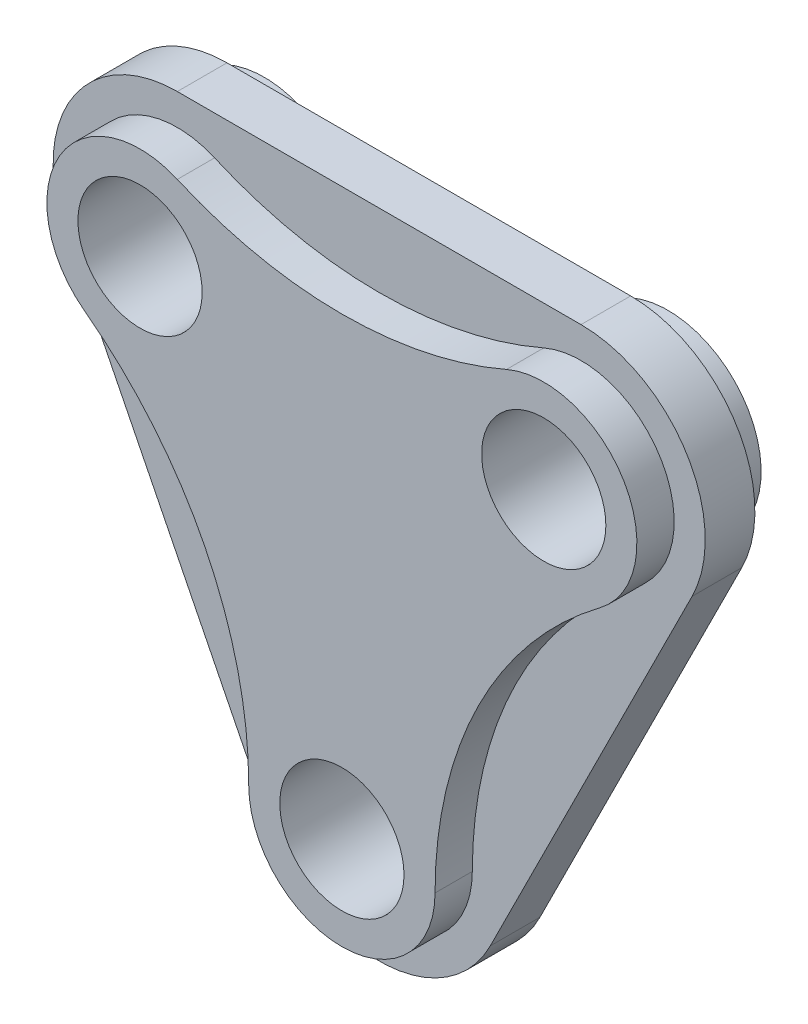
ISO-10303-21;
HEADER;
FILE_DESCRIPTION(('STEP AP214'),'2;1');
FILE_NAME('part.step','',(''),(''),'','','');
FILE_SCHEMA(('AUTOMOTIVE_DESIGN { 1 0 10303 214 1 1 1 1 }'));
ENDSEC;
DATA;
#1=APPLICATION_CONTEXT('core data for automotive mechanical design processes');
#2=APPLICATION_PROTOCOL_DEFINITION('international standard','automotive_design',2000,#1);
#3=PRODUCT_CONTEXT('',#1,'mechanical');
#4=PRODUCT('Part','Part','',(#3));
#5=PRODUCT_RELATED_PRODUCT_CATEGORY('part','',(#4));
#6=PRODUCT_DEFINITION_FORMATION('','',#4);
#7=PRODUCT_DEFINITION_CONTEXT('part definition',#1,'design');
#8=PRODUCT_DEFINITION('design','',#6,#7);
#9=PRODUCT_DEFINITION_SHAPE('','',#8);
#10=(LENGTH_UNIT() NAMED_UNIT(*) SI_UNIT(.MILLI.,.METRE.));
#11=(NAMED_UNIT(*) PLANE_ANGLE_UNIT() SI_UNIT($,.RADIAN.));
#12=(NAMED_UNIT(*) SI_UNIT($,.STERADIAN.) SOLID_ANGLE_UNIT());
#13=UNCERTAINTY_MEASURE_WITH_UNIT(LENGTH_MEASURE(1.E-05),#10,'distance_accuracy_value','');
#14=(GEOMETRIC_REPRESENTATION_CONTEXT(3) GLOBAL_UNCERTAINTY_ASSIGNED_CONTEXT((#13)) GLOBAL_UNIT_ASSIGNED_CONTEXT((#10,
#11,#12)) REPRESENTATION_CONTEXT('',''));
#15=CARTESIAN_POINT('',(0.,0.,0.));
#16=DIRECTION('',(0.,0.,1.));
#17=DIRECTION('',(1.,0.,0.));
#18=AXIS2_PLACEMENT_3D('',#15,#16,#17);
#19=CARTESIAN_POINT('',(0.,74.4668550430326,10.));
#20=DIRECTION('',(0.,0.,-1.));
#21=DIRECTION('',(-1.,0.,0.));
#22=AXIS2_PLACEMENT_3D('',#19,#20,#21);
#23=CYLINDRICAL_SURFACE('',#22,66.2500000000001);
#24=DIRECTION('',(0.,0.,-1.));
#25=VECTOR('',#24,1.);
#26=CARTESIAN_POINT('',(-26.5,13.7477270848675,10.));
#27=LINE('',#26,#25);
#28=CARTESIAN_POINT('',(-26.5,13.7477270848675,-4.));
#29=VERTEX_POINT('',#28);
#30=CARTESIAN_POINT('',(-26.5,13.7477270848675,-10.));
#31=VERTEX_POINT('',#30);
#32=EDGE_CURVE('E54',#29,#31,#27,.T.);
#33=ORIENTED_EDGE('',*,*,#32,.F.);
#34=CARTESIAN_POINT('',(0.,74.4668550430326,-4.));
#35=DIRECTION('',(0.,0.,1.));
#36=DIRECTION('',(1.,0.,0.));
#37=AXIS2_PLACEMENT_3D('',#34,#35,#36);
#38=CIRCLE('',#37,66.2500000000001);
#39=CARTESIAN_POINT('',(26.5,13.7477270848675,-4.));
#40=VERTEX_POINT('',#39);
#41=EDGE_CURVE('E336',#29,#40,#38,.T.);
#42=ORIENTED_EDGE('',*,*,#41,.T.);
#43=DIRECTION('',(0.,0.,-1.));
#44=VECTOR('',#43,1.);
#45=CARTESIAN_POINT('',(26.5,13.7477270848675,10.));
#46=LINE('',#45,#44);
#47=CARTESIAN_POINT('',(26.5,13.7477270848675,-10.));
#48=VERTEX_POINT('',#47);
#49=EDGE_CURVE('E243',#40,#48,#46,.T.);
#50=ORIENTED_EDGE('',*,*,#49,.T.);
#51=CARTESIAN_POINT('',(0.,74.4668550430326,-10.));
#52=DIRECTION('',(0.,0.,1.));
#53=DIRECTION('',(1.,0.,0.));
#54=AXIS2_PLACEMENT_3D('',#51,#52,#53);
#55=CIRCLE('',#54,66.2500000000001);
#56=EDGE_CURVE('E199',#31,#48,#55,.T.);
#57=ORIENTED_EDGE('',*,*,#56,.F.);
#58=EDGE_LOOP('',(#33,#42,#50,#57));
#59=FACE_BOUND('',#58,.T.);
#60=ADVANCED_FACE('F45',(#59),#23,.F.);
#61=CARTESIAN_POINT('',(-32.5,0.,10.));
#62=DIRECTION('',(0.,0.,-1.));
#63=DIRECTION('',(-1.,0.,0.));
#64=AXIS2_PLACEMENT_3D('',#61,#62,#63);
#65=CYLINDRICAL_SURFACE('',#64,15.);
#66=DIRECTION('',(0.,0.,-1.));
#67=VECTOR('',#66,1.);
#68=CARTESIAN_POINT('',(-41.5,-12.,10.));
#69=LINE('',#68,#67);
#70=CARTESIAN_POINT('',(-41.5,-12.,-4.));
#71=VERTEX_POINT('',#70);
#72=CARTESIAN_POINT('',(-41.5,-12.,-10.));
#73=VERTEX_POINT('',#72);
#74=EDGE_CURVE('E293',#71,#73,#69,.T.);
#75=ORIENTED_EDGE('',*,*,#74,.F.);
#76=CARTESIAN_POINT('',(-32.5,0.,-4.));
#77=DIRECTION('',(0.,0.,1.));
#78=DIRECTION('',(1.,0.,0.));
#79=AXIS2_PLACEMENT_3D('',#76,#77,#78);
#80=CIRCLE('',#79,15.);
#81=EDGE_CURVE('E61',#71,#29,#80,.F.);
#82=ORIENTED_EDGE('',*,*,#81,.T.);
#83=ORIENTED_EDGE('',*,*,#32,.T.);
#84=CARTESIAN_POINT('',(-32.5,0.,-10.));
#85=DIRECTION('',(0.,0.,1.));
#86=DIRECTION('',(1.,0.,0.));
#87=AXIS2_PLACEMENT_3D('',#84,#85,#86);
#88=CIRCLE('',#87,15.);
#89=EDGE_CURVE('E204',#73,#31,#88,.F.);
#90=ORIENTED_EDGE('',*,*,#89,.F.);
#91=EDGE_LOOP('',(#75,#82,#83,#90));
#92=FACE_BOUND('',#91,.T.);
#93=ADVANCED_FACE('F309',(#92),#65,.T.);
#94=CARTESIAN_POINT('',(-81.2500000000001,-65.0000000000001,10.));
#95=DIRECTION('',(0.,0.,-1.));
#96=DIRECTION('',(-1.,0.,0.));
#97=AXIS2_PLACEMENT_3D('',#94,#95,#96);
#98=CYLINDRICAL_SURFACE('',#97,66.2500000000001);
#99=CARTESIAN_POINT('',(-81.2500000000001,-65.0000000000001,-4.));
#100=DIRECTION('',(0.,0.,1.));
#101=DIRECTION('',(1.,0.,0.));
#102=AXIS2_PLACEMENT_3D('',#99,#100,#101);
#103=CIRCLE('',#102,66.2500000000001);
#104=CARTESIAN_POINT('',(-15.,-65.,-4.));
#105=VERTEX_POINT('',#104);
#106=EDGE_CURVE('E69',#71,#105,#103,.F.);
#107=ORIENTED_EDGE('',*,*,#106,.F.);
#108=ORIENTED_EDGE('',*,*,#74,.T.);
#109=CARTESIAN_POINT('',(-81.2500000000001,-65.0000000000001,-10.));
#110=DIRECTION('',(0.,0.,1.));
#111=DIRECTION('',(1.,0.,0.));
#112=AXIS2_PLACEMENT_3D('',#109,#110,#111);
#113=CIRCLE('',#112,66.2500000000001);
#114=CARTESIAN_POINT('',(-15.,-65.,-10.));
#115=VERTEX_POINT('',#114);
#116=EDGE_CURVE('E248',#73,#115,#113,.F.);
#117=ORIENTED_EDGE('',*,*,#116,.T.);
#118=DIRECTION('',(0.,0.,-1.));
#119=VECTOR('',#118,1.);
#120=CARTESIAN_POINT('',(-15.,-65.,10.));
#121=LINE('',#120,#119);
#122=EDGE_CURVE('E289',#105,#115,#121,.T.);
#123=ORIENTED_EDGE('',*,*,#122,.F.);
#124=EDGE_LOOP('',(#107,#108,#117,#123));
#125=FACE_BOUND('',#124,.T.);
#126=ADVANCED_FACE('F303',(#125),#98,.F.);
#127=CARTESIAN_POINT('',(0.,-65.,10.));
#128=DIRECTION('',(0.,0.,-1.));
#129=DIRECTION('',(-1.,0.,0.));
#130=AXIS2_PLACEMENT_3D('',#127,#128,#129);
#131=CYLINDRICAL_SURFACE('',#130,15.);
#132=CARTESIAN_POINT('',(0.,-65.,-4.));
#133=DIRECTION('',(0.,0.,1.));
#134=DIRECTION('',(1.,0.,0.));
#135=AXIS2_PLACEMENT_3D('',#132,#133,#134);
#136=CIRCLE('',#135,15.);
#137=CARTESIAN_POINT('',(15.,-65.,-4.));
#138=VERTEX_POINT('',#137);
#139=EDGE_CURVE('E327',#105,#138,#136,.T.);
#140=ORIENTED_EDGE('',*,*,#139,.F.);
#141=ORIENTED_EDGE('',*,*,#122,.T.);
#142=CARTESIAN_POINT('',(0.,-65.,-10.));
#143=DIRECTION('',(0.,0.,1.));
#144=DIRECTION('',(1.,0.,0.));
#145=AXIS2_PLACEMENT_3D('',#142,#143,#144);
#146=CIRCLE('',#145,15.);
#147=CARTESIAN_POINT('',(15.,-65.,-10.));
#148=VERTEX_POINT('',#147);
#149=EDGE_CURVE('E252',#115,#148,#146,.T.);
#150=ORIENTED_EDGE('',*,*,#149,.T.);
#151=DIRECTION('',(0.,0.,-1.));
#152=VECTOR('',#151,1.);
#153=CARTESIAN_POINT('',(15.,-65.,10.));
#154=LINE('',#153,#152);
#155=EDGE_CURVE('E284',#138,#148,#154,.T.);
#156=ORIENTED_EDGE('',*,*,#155,.F.);
#157=EDGE_LOOP('',(#140,#141,#150,#156));
#158=FACE_BOUND('',#157,.T.);
#159=ADVANCED_FACE('F326',(#158),#131,.T.);
#160=CARTESIAN_POINT('',(81.2500000000001,-65.0000000000001,10.));
#161=DIRECTION('',(0.,0.,-1.));
#162=DIRECTION('',(-1.,0.,0.));
#163=AXIS2_PLACEMENT_3D('',#160,#161,#162);
#164=CYLINDRICAL_SURFACE('',#163,66.2500000000001);
#165=DIRECTION('',(0.,0.,-1.));
#166=VECTOR('',#165,1.);
#167=CARTESIAN_POINT('',(41.5,-12.,10.));
#168=LINE('',#167,#166);
#169=CARTESIAN_POINT('',(41.5,-12.,-4.));
#170=VERTEX_POINT('',#169);
#171=CARTESIAN_POINT('',(41.5,-12.,-10.));
#172=VERTEX_POINT('',#171);
#173=EDGE_CURVE('E279',#170,#172,#168,.T.);
#174=ORIENTED_EDGE('',*,*,#173,.F.);
#175=CARTESIAN_POINT('',(81.2500000000001,-65.0000000000001,-4.));
#176=DIRECTION('',(0.,0.,1.));
#177=DIRECTION('',(1.,0.,0.));
#178=AXIS2_PLACEMENT_3D('',#175,#176,#177);
#179=CIRCLE('',#178,66.2500000000001);
#180=EDGE_CURVE('E322',#170,#138,#179,.T.);
#181=ORIENTED_EDGE('',*,*,#180,.T.);
#182=ORIENTED_EDGE('',*,*,#155,.T.);
#183=CARTESIAN_POINT('',(81.2500000000001,-65.0000000000001,-10.));
#184=DIRECTION('',(0.,0.,1.));
#185=DIRECTION('',(1.,0.,0.));
#186=AXIS2_PLACEMENT_3D('',#183,#184,#185);
#187=CIRCLE('',#186,66.2500000000001);
#188=EDGE_CURVE('E256',#172,#148,#187,.T.);
#189=ORIENTED_EDGE('',*,*,#188,.F.);
#190=EDGE_LOOP('',(#174,#181,#182,#189));
#191=FACE_BOUND('',#190,.T.);
#192=ADVANCED_FACE('F319',(#191),#164,.F.);
#193=CARTESIAN_POINT('',(32.5,0.,10.));
#194=DIRECTION('',(0.,0.,-1.));
#195=DIRECTION('',(-1.,0.,0.));
#196=AXIS2_PLACEMENT_3D('',#193,#194,#195);
#197=CYLINDRICAL_SURFACE('',#196,15.);
#198=CARTESIAN_POINT('',(32.5,0.,-4.));
#199=DIRECTION('',(0.,0.,1.));
#200=DIRECTION('',(1.,0.,0.));
#201=AXIS2_PLACEMENT_3D('',#198,#199,#200);
#202=CIRCLE('',#201,15.);
#203=EDGE_CURVE('E333',#170,#40,#202,.T.);
#204=ORIENTED_EDGE('',*,*,#203,.F.);
#205=ORIENTED_EDGE('',*,*,#173,.T.);
#206=CARTESIAN_POINT('',(32.5,0.,-10.));
#207=DIRECTION('',(0.,0.,1.));
#208=DIRECTION('',(1.,0.,0.));
#209=AXIS2_PLACEMENT_3D('',#206,#207,#208);
#210=CIRCLE('',#209,15.);
#211=EDGE_CURVE('E260',#172,#48,#210,.T.);
#212=ORIENTED_EDGE('',*,*,#211,.T.);
#213=ORIENTED_EDGE('',*,*,#49,.F.);
#214=EDGE_LOOP('',(#204,#205,#212,#213));
#215=FACE_BOUND('',#214,.T.);
#216=ADVANCED_FACE('F331',(#215),#197,.T.);
#217=CARTESIAN_POINT('',(0.,74.4668550430326,4.));
#218=DIRECTION('',(0.,0.,1.));
#219=DIRECTION('',(1.,0.,0.));
#220=AXIS2_PLACEMENT_3D('',#217,#218,#219);
#221=CIRCLE('',#220,66.2500000000001);
#222=CARTESIAN_POINT('',(-26.5,13.7477270848675,4.));
#223=VERTEX_POINT('',#222);
#224=CARTESIAN_POINT('',(26.5,13.7477270848675,4.));
#225=VERTEX_POINT('',#224);
#226=EDGE_CURVE('E408',#223,#225,#221,.T.);
#227=ORIENTED_EDGE('',*,*,#226,.F.);
#228=CARTESIAN_POINT('',(-26.5,13.7477270848675,10.));
#229=VERTEX_POINT('',#228);
#230=EDGE_CURVE('E11',#229,#223,#27,.T.);
#231=ORIENTED_EDGE('',*,*,#230,.F.);
#232=CARTESIAN_POINT('',(0.,74.4668550430326,10.));
#233=DIRECTION('',(0.,0.,1.));
#234=DIRECTION('',(1.,0.,0.));
#235=AXIS2_PLACEMENT_3D('',#232,#233,#234);
#236=CIRCLE('',#235,66.2500000000001);
#237=CARTESIAN_POINT('',(26.5,13.7477270848675,10.));
#238=VERTEX_POINT('',#237);
#239=EDGE_CURVE('E210',#229,#238,#236,.T.);
#240=ORIENTED_EDGE('',*,*,#239,.T.);
#241=EDGE_CURVE('E275',#238,#225,#46,.T.);
#242=ORIENTED_EDGE('',*,*,#241,.T.);
#243=EDGE_LOOP('',(#227,#231,#240,#242));
#244=FACE_BOUND('',#243,.T.);
#245=ADVANCED_FACE('F47',(#244),#23,.F.);
#246=CARTESIAN_POINT('',(-32.5,0.,4.));
#247=DIRECTION('',(0.,0.,1.));
#248=DIRECTION('',(1.,0.,0.));
#249=AXIS2_PLACEMENT_3D('',#246,#247,#248);
#250=CIRCLE('',#249,15.);
#251=CARTESIAN_POINT('',(-41.5,-12.,4.));
#252=VERTEX_POINT('',#251);
#253=EDGE_CURVE('E401',#252,#223,#250,.F.);
#254=ORIENTED_EDGE('',*,*,#253,.F.);
#255=CARTESIAN_POINT('',(-41.5,-12.,10.));
#256=VERTEX_POINT('',#255);
#257=EDGE_CURVE('E294',#256,#252,#69,.T.);
#258=ORIENTED_EDGE('',*,*,#257,.F.);
#259=CARTESIAN_POINT('',(-32.5,0.,10.));
#260=DIRECTION('',(0.,0.,1.));
#261=DIRECTION('',(1.,0.,0.));
#262=AXIS2_PLACEMENT_3D('',#259,#260,#261);
#263=CIRCLE('',#262,15.);
#264=EDGE_CURVE('E214',#256,#229,#263,.F.);
#265=ORIENTED_EDGE('',*,*,#264,.T.);
#266=ORIENTED_EDGE('',*,*,#230,.T.);
#267=EDGE_LOOP('',(#254,#258,#265,#266));
#268=FACE_BOUND('',#267,.T.);
#269=ADVANCED_FACE('F440',(#268),#65,.T.);
#270=ORIENTED_EDGE('',*,*,#257,.T.);
#271=CARTESIAN_POINT('',(-81.2500000000001,-65.0000000000001,4.));
#272=DIRECTION('',(0.,0.,1.));
#273=DIRECTION('',(1.,0.,0.));
#274=AXIS2_PLACEMENT_3D('',#271,#272,#273);
#275=CIRCLE('',#274,66.2500000000001);
#276=CARTESIAN_POINT('',(-15.,-65.,4.));
#277=VERTEX_POINT('',#276);
#278=EDGE_CURVE('E352',#252,#277,#275,.F.);
#279=ORIENTED_EDGE('',*,*,#278,.T.);
#280=CARTESIAN_POINT('',(-15.,-65.,10.));
#281=VERTEX_POINT('',#280);
#282=EDGE_CURVE('E290',#281,#277,#121,.T.);
#283=ORIENTED_EDGE('',*,*,#282,.F.);
#284=CARTESIAN_POINT('',(-81.2500000000001,-65.0000000000001,10.));
#285=DIRECTION('',(0.,0.,1.));
#286=DIRECTION('',(1.,0.,0.));
#287=AXIS2_PLACEMENT_3D('',#284,#285,#286);
#288=CIRCLE('',#287,66.2500000000001);
#289=EDGE_CURVE('E219',#256,#281,#288,.F.);
#290=ORIENTED_EDGE('',*,*,#289,.F.);
#291=EDGE_LOOP('',(#270,#279,#283,#290));
#292=FACE_BOUND('',#291,.T.);
#293=ADVANCED_FACE('F447',(#292),#98,.F.);
#294=ORIENTED_EDGE('',*,*,#282,.T.);
#295=CARTESIAN_POINT('',(0.,-65.,4.));
#296=DIRECTION('',(0.,0.,1.));
#297=DIRECTION('',(1.,0.,0.));
#298=AXIS2_PLACEMENT_3D('',#295,#296,#297);
#299=CIRCLE('',#298,15.);
#300=CARTESIAN_POINT('',(15.,-65.,4.));
#301=VERTEX_POINT('',#300);
#302=EDGE_CURVE('E418',#277,#301,#299,.T.);
#303=ORIENTED_EDGE('',*,*,#302,.T.);
#304=CARTESIAN_POINT('',(15.,-65.,10.));
#305=VERTEX_POINT('',#304);
#306=EDGE_CURVE('E285',#305,#301,#154,.T.);
#307=ORIENTED_EDGE('',*,*,#306,.F.);
#308=CARTESIAN_POINT('',(0.,-65.,10.));
#309=DIRECTION('',(0.,0.,1.));
#310=DIRECTION('',(1.,0.,0.));
#311=AXIS2_PLACEMENT_3D('',#308,#309,#310);
#312=CIRCLE('',#311,15.);
#313=EDGE_CURVE('E222',#281,#305,#312,.T.);
#314=ORIENTED_EDGE('',*,*,#313,.F.);
#315=EDGE_LOOP('',(#294,#303,#307,#314));
#316=FACE_BOUND('',#315,.T.);
#317=ADVANCED_FACE('F469',(#316),#131,.T.);
#318=CARTESIAN_POINT('',(81.2500000000001,-65.0000000000001,4.));
#319=DIRECTION('',(0.,0.,1.));
#320=DIRECTION('',(1.,0.,0.));
#321=AXIS2_PLACEMENT_3D('',#318,#319,#320);
#322=CIRCLE('',#321,66.2500000000001);
#323=CARTESIAN_POINT('',(41.5,-12.,4.));
#324=VERTEX_POINT('',#323);
#325=EDGE_CURVE('E415',#324,#301,#322,.T.);
#326=ORIENTED_EDGE('',*,*,#325,.F.);
#327=CARTESIAN_POINT('',(41.5,-12.,10.));
#328=VERTEX_POINT('',#327);
#329=EDGE_CURVE('E280',#328,#324,#168,.T.);
#330=ORIENTED_EDGE('',*,*,#329,.F.);
#331=CARTESIAN_POINT('',(81.2500000000001,-65.0000000000001,10.));
#332=DIRECTION('',(0.,0.,1.));
#333=DIRECTION('',(1.,0.,0.));
#334=AXIS2_PLACEMENT_3D('',#331,#332,#333);
#335=CIRCLE('',#334,66.2500000000001);
#336=EDGE_CURVE('E225',#328,#305,#335,.T.);
#337=ORIENTED_EDGE('',*,*,#336,.T.);
#338=ORIENTED_EDGE('',*,*,#306,.T.);
#339=EDGE_LOOP('',(#326,#330,#337,#338));
#340=FACE_BOUND('',#339,.T.);
#341=ADVANCED_FACE('F465',(#340),#164,.F.);
#342=CARTESIAN_POINT('',(32.5,0.,10.));
#343=DIRECTION('',(0.,0.,-1.));
#344=DIRECTION('',(-1.,0.,0.));
#345=AXIS2_PLACEMENT_3D('',#342,#343,#344);
#346=CYLINDRICAL_SURFACE('',#345,10.);
#347=CARTESIAN_POINT('',(32.5,0.,10.));
#348=DIRECTION('',(0.,0.,1.));
#349=DIRECTION('',(1.,0.,0.));
#350=AXIS2_PLACEMENT_3D('',#347,#348,#349);
#351=CIRCLE('',#350,10.);
#352=CARTESIAN_POINT('',(42.5,0.,10.));
#353=VERTEX_POINT('',#352);
#354=EDGE_CURVE('E236',#353,#353,#351,.T.);
#355=ORIENTED_EDGE('',*,*,#354,.T.);
#356=EDGE_LOOP('',(#355));
#357=FACE_BOUND('',#356,.T.);
#358=CARTESIAN_POINT('',(32.5,0.,-10.));
#359=DIRECTION('',(0.,0.,1.));
#360=DIRECTION('',(1.,0.,0.));
#361=AXIS2_PLACEMENT_3D('',#358,#359,#360);
#362=CIRCLE('',#361,10.);
#363=CARTESIAN_POINT('',(42.5,0.,-10.));
#364=VERTEX_POINT('',#363);
#365=EDGE_CURVE('E268',#364,#364,#362,.T.);
#366=ORIENTED_EDGE('',*,*,#365,.F.);
#367=EDGE_LOOP('',(#366));
#368=FACE_BOUND('',#367,.T.);
#369=ADVANCED_FACE('F485',(#357,#368),#346,.F.);
#370=CARTESIAN_POINT('',(-32.5,0.,10.));
#371=DIRECTION('',(0.,0.,-1.));
#372=DIRECTION('',(-1.,0.,0.));
#373=AXIS2_PLACEMENT_3D('',#370,#371,#372);
#374=CYLINDRICAL_SURFACE('',#373,10.);
#375=CARTESIAN_POINT('',(-32.5,0.,10.));
#376=DIRECTION('',(0.,0.,1.));
#377=DIRECTION('',(1.,0.,0.));
#378=AXIS2_PLACEMENT_3D('',#375,#376,#377);
#379=CIRCLE('',#378,10.);
#380=CARTESIAN_POINT('',(-22.5,0.,10.));
#381=VERTEX_POINT('',#380);
#382=EDGE_CURVE('E232',#381,#381,#379,.F.);
#383=ORIENTED_EDGE('',*,*,#382,.F.);
#384=EDGE_LOOP('',(#383));
#385=FACE_BOUND('',#384,.T.);
#386=CARTESIAN_POINT('',(-32.5,0.,-10.));
#387=DIRECTION('',(0.,0.,1.));
#388=DIRECTION('',(1.,0.,0.));
#389=AXIS2_PLACEMENT_3D('',#386,#387,#388);
#390=CIRCLE('',#389,10.);
#391=CARTESIAN_POINT('',(-22.5,0.,-10.));
#392=VERTEX_POINT('',#391);
#393=EDGE_CURVE('E264',#392,#392,#390,.F.);
#394=ORIENTED_EDGE('',*,*,#393,.T.);
#395=EDGE_LOOP('',(#394));
#396=FACE_BOUND('',#395,.T.);
#397=ADVANCED_FACE('F489',(#385,#396),#374,.F.);
#398=ORIENTED_EDGE('',*,*,#329,.T.);
#399=CARTESIAN_POINT('',(32.5,0.,4.));
#400=DIRECTION('',(0.,0.,1.));
#401=DIRECTION('',(1.,0.,0.));
#402=AXIS2_PLACEMENT_3D('',#399,#400,#401);
#403=CIRCLE('',#402,15.);
#404=EDGE_CURVE('E411',#324,#225,#403,.T.);
#405=ORIENTED_EDGE('',*,*,#404,.T.);
#406=ORIENTED_EDGE('',*,*,#241,.F.);
#407=CARTESIAN_POINT('',(32.5,0.,10.));
#408=DIRECTION('',(0.,0.,1.));
#409=DIRECTION('',(1.,0.,0.));
#410=AXIS2_PLACEMENT_3D('',#407,#408,#409);
#411=CIRCLE('',#410,15.);
#412=EDGE_CURVE('E229',#328,#238,#411,.T.);
#413=ORIENTED_EDGE('',*,*,#412,.F.);
#414=EDGE_LOOP('',(#398,#405,#406,#413));
#415=FACE_BOUND('',#414,.T.);
#416=ADVANCED_FACE('F450',(#415),#197,.T.);
#417=CARTESIAN_POINT('',(0.,-65.,10.));
#418=DIRECTION('',(0.,0.,-1.));
#419=DIRECTION('',(-1.,0.,0.));
#420=AXIS2_PLACEMENT_3D('',#417,#418,#419);
#421=CYLINDRICAL_SURFACE('',#420,10.);
#422=CARTESIAN_POINT('',(0.,-65.,10.));
#423=DIRECTION('',(0.,0.,1.));
#424=DIRECTION('',(1.,0.,0.));
#425=AXIS2_PLACEMENT_3D('',#422,#423,#424);
#426=CIRCLE('',#425,10.);
#427=CARTESIAN_POINT('',(10.,-65.,10.));
#428=VERTEX_POINT('',#427);
#429=EDGE_CURVE('E240',#428,#428,#426,.T.);
#430=ORIENTED_EDGE('',*,*,#429,.T.);
#431=EDGE_LOOP('',(#430));
#432=FACE_BOUND('',#431,.T.);
#433=CARTESIAN_POINT('',(0.,-65.,-10.));
#434=DIRECTION('',(0.,0.,1.));
#435=DIRECTION('',(1.,0.,0.));
#436=AXIS2_PLACEMENT_3D('',#433,#434,#435);
#437=CIRCLE('',#436,10.);
#438=CARTESIAN_POINT('',(10.,-65.,-10.));
#439=VERTEX_POINT('',#438);
#440=EDGE_CURVE('E215',#439,#439,#437,.T.);
#441=ORIENTED_EDGE('',*,*,#440,.F.);
#442=EDGE_LOOP('',(#441));
#443=FACE_BOUND('',#442,.T.);
#444=ADVANCED_FACE('F488',(#432,#443),#421,.F.);
#445=CARTESIAN_POINT('',(0.,0.,10.));
#446=DIRECTION('',(0.,0.,1.));
#447=DIRECTION('',(1.,0.,0.));
#448=AXIS2_PLACEMENT_3D('',#445,#446,#447);
#449=PLANE('',#448);
#450=ORIENTED_EDGE('',*,*,#239,.F.);
#451=ORIENTED_EDGE('',*,*,#264,.F.);
#452=ORIENTED_EDGE('',*,*,#289,.T.);
#453=ORIENTED_EDGE('',*,*,#313,.T.);
#454=ORIENTED_EDGE('',*,*,#336,.F.);
#455=ORIENTED_EDGE('',*,*,#412,.T.);
#456=EDGE_LOOP('',(#450,#451,#452,#453,#454,#455));
#457=FACE_BOUND('',#456,.T.);
#458=ORIENTED_EDGE('',*,*,#382,.T.);
#459=EDGE_LOOP('',(#458));
#460=FACE_BOUND('',#459,.T.);
#461=ORIENTED_EDGE('',*,*,#354,.F.);
#462=EDGE_LOOP('',(#461));
#463=FACE_BOUND('',#462,.T.);
#464=ORIENTED_EDGE('',*,*,#429,.F.);
#465=EDGE_LOOP('',(#464));
#466=FACE_BOUND('',#465,.T.);
#467=ADVANCED_FACE('F457',(#457,#460,#463,#466),#449,.T.);
#468=CARTESIAN_POINT('',(0.,0.,-10.));
#469=DIRECTION('',(0.,0.,1.));
#470=DIRECTION('',(1.,0.,0.));
#471=AXIS2_PLACEMENT_3D('',#468,#469,#470);
#472=PLANE('',#471);
#473=ORIENTED_EDGE('',*,*,#56,.T.);
#474=ORIENTED_EDGE('',*,*,#211,.F.);
#475=ORIENTED_EDGE('',*,*,#188,.T.);
#476=ORIENTED_EDGE('',*,*,#149,.F.);
#477=ORIENTED_EDGE('',*,*,#116,.F.);
#478=ORIENTED_EDGE('',*,*,#89,.T.);
#479=EDGE_LOOP('',(#473,#474,#475,#476,#477,#478));
#480=FACE_BOUND('',#479,.T.);
#481=ORIENTED_EDGE('',*,*,#393,.F.);
#482=EDGE_LOOP('',(#481));
#483=FACE_BOUND('',#482,.T.);
#484=ORIENTED_EDGE('',*,*,#365,.T.);
#485=EDGE_LOOP('',(#484));
#486=FACE_BOUND('',#485,.T.);
#487=ORIENTED_EDGE('',*,*,#440,.T.);
#488=EDGE_LOOP('',(#487));
#489=FACE_BOUND('',#488,.T.);
#490=ADVANCED_FACE('F307',(#480,#483,#486,#489),#472,.F.);
#491=CARTESIAN_POINT('',(-43.8885438199983,-21.9442719099992,4.));
#492=DIRECTION('',(0.894427190999916,0.447213595499958,0.));
#493=DIRECTION('',(-0.447213595499958,0.894427190999916,0.));
#494=AXIS2_PLACEMENT_3D('',#491,#492,#493);
#495=PLANE('',#494);
#496=DIRECTION('',(0.447213595499958,-0.894427190999916,0.));
#497=VECTOR('',#496,1.);
#498=CARTESIAN_POINT('',(-43.8885438199983,-21.9442719099992,-4.));
#499=LINE('',#498,#497);
#500=CARTESIAN_POINT('',(-50.3885438199983,-8.94427190999916,-4.));
#501=VERTEX_POINT('',#500);
#502=CARTESIAN_POINT('',(-17.8885438199983,-73.9442719099992,-4.));
#503=VERTEX_POINT('',#502);
#504=EDGE_CURVE('E197',#501,#503,#499,.T.);
#505=ORIENTED_EDGE('',*,*,#504,.T.);
#506=DIRECTION('',(0.,0.,-1.));
#507=VECTOR('',#506,1.);
#508=CARTESIAN_POINT('',(-17.8885438199983,-73.9442719099992,4.));
#509=LINE('',#508,#507);
#510=CARTESIAN_POINT('',(-17.8885438199983,-73.9442719099992,4.));
#511=VERTEX_POINT('',#510);
#512=EDGE_CURVE('E176',#511,#503,#509,.T.);
#513=ORIENTED_EDGE('',*,*,#512,.F.);
#514=DIRECTION('',(0.447213595499958,-0.894427190999916,0.));
#515=VECTOR('',#514,1.);
#516=CARTESIAN_POINT('',(-43.8885438199983,-21.9442719099992,4.));
#517=LINE('',#516,#515);
#518=CARTESIAN_POINT('',(-50.3885438199983,-8.94427190999916,4.));
#519=VERTEX_POINT('',#518);
#520=EDGE_CURVE('E184',#519,#511,#517,.T.);
#521=ORIENTED_EDGE('',*,*,#520,.F.);
#522=DIRECTION('',(0.,0.,-1.));
#523=VECTOR('',#522,1.);
#524=CARTESIAN_POINT('',(-50.3885438199983,-8.94427190999916,4.));
#525=LINE('',#524,#523);
#526=EDGE_CURVE('E348',#519,#501,#525,.T.);
#527=ORIENTED_EDGE('',*,*,#526,.T.);
#528=EDGE_LOOP('',(#505,#513,#521,#527));
#529=FACE_BOUND('',#528,.T.);
#530=ADVANCED_FACE('F195',(#529),#495,.F.);
#531=CARTESIAN_POINT('',(0.,-65.,4.));
#532=DIRECTION('',(0.,0.,-1.));
#533=DIRECTION('',(-1.,0.,0.));
#534=AXIS2_PLACEMENT_3D('',#531,#532,#533);
#535=CYLINDRICAL_SURFACE('',#534,20.);
#536=CARTESIAN_POINT('',(0.,-65.,-4.));
#537=DIRECTION('',(0.,0.,1.));
#538=DIRECTION('',(1.,0.,0.));
#539=AXIS2_PLACEMENT_3D('',#536,#537,#538);
#540=CIRCLE('',#539,20.);
#541=CARTESIAN_POINT('',(17.8885438199983,-73.9442719099992,-4.));
#542=VERTEX_POINT('',#541);
#543=EDGE_CURVE('E383',#503,#542,#540,.T.);
#544=ORIENTED_EDGE('',*,*,#543,.T.);
#545=DIRECTION('',(0.,0.,-1.));
#546=VECTOR('',#545,1.);
#547=CARTESIAN_POINT('',(17.8885438199983,-73.9442719099992,4.));
#548=LINE('',#547,#546);
#549=CARTESIAN_POINT('',(17.8885438199983,-73.9442719099992,4.));
#550=VERTEX_POINT('',#549);
#551=EDGE_CURVE('E179',#550,#542,#548,.T.);
#552=ORIENTED_EDGE('',*,*,#551,.F.);
#553=CARTESIAN_POINT('',(0.,-65.,4.));
#554=DIRECTION('',(0.,0.,1.));
#555=DIRECTION('',(1.,0.,0.));
#556=AXIS2_PLACEMENT_3D('',#553,#554,#555);
#557=CIRCLE('',#556,20.);
#558=EDGE_CURVE('E172',#511,#550,#557,.T.);
#559=ORIENTED_EDGE('',*,*,#558,.F.);
#560=ORIENTED_EDGE('',*,*,#512,.T.);
#561=EDGE_LOOP('',(#544,#552,#559,#560));
#562=FACE_BOUND('',#561,.T.);
#563=ADVANCED_FACE('F174',(#562),#535,.T.);
#564=CARTESIAN_POINT('',(43.8885438199983,-21.9442719099992,4.));
#565=DIRECTION('',(-0.894427190999916,0.447213595499958,0.));
#566=DIRECTION('',(-0.447213595499958,-0.894427190999916,0.));
#567=AXIS2_PLACEMENT_3D('',#564,#565,#566);
#568=PLANE('',#567);
#569=DIRECTION('',(0.447213595499958,0.894427190999916,0.));
#570=VECTOR('',#569,1.);
#571=CARTESIAN_POINT('',(43.8885438199983,-21.9442719099992,-4.));
#572=LINE('',#571,#570);
#573=CARTESIAN_POINT('',(50.3885438199983,-8.94427190999916,-4.));
#574=VERTEX_POINT('',#573);
#575=EDGE_CURVE('E373',#542,#574,#572,.T.);
#576=ORIENTED_EDGE('',*,*,#575,.T.);
#577=DIRECTION('',(0.,0.,-1.));
#578=VECTOR('',#577,1.);
#579=CARTESIAN_POINT('',(50.3885438199983,-8.94427190999916,4.));
#580=LINE('',#579,#578);
#581=CARTESIAN_POINT('',(50.3885438199983,-8.94427190999916,4.));
#582=VERTEX_POINT('',#581);
#583=EDGE_CURVE('E206',#582,#574,#580,.T.);
#584=ORIENTED_EDGE('',*,*,#583,.F.);
#585=DIRECTION('',(0.447213595499958,0.894427190999916,0.));
#586=VECTOR('',#585,1.);
#587=CARTESIAN_POINT('',(43.8885438199983,-21.9442719099992,4.));
#588=LINE('',#587,#586);
#589=EDGE_CURVE('E183',#550,#582,#588,.T.);
#590=ORIENTED_EDGE('',*,*,#589,.F.);
#591=ORIENTED_EDGE('',*,*,#551,.T.);
#592=EDGE_LOOP('',(#576,#584,#590,#591));
#593=FACE_BOUND('',#592,.T.);
#594=ADVANCED_FACE('F426',(#593),#568,.F.);
#595=CARTESIAN_POINT('',(32.5,0.,4.));
#596=DIRECTION('',(0.,0.,-1.));
#597=DIRECTION('',(-1.,0.,0.));
#598=AXIS2_PLACEMENT_3D('',#595,#596,#597);
#599=CYLINDRICAL_SURFACE('',#598,20.);
#600=CARTESIAN_POINT('',(32.5,0.,-4.));
#601=DIRECTION('',(0.,0.,1.));
#602=DIRECTION('',(1.,0.,0.));
#603=AXIS2_PLACEMENT_3D('',#600,#601,#602);
#604=CIRCLE('',#603,20.);
#605=CARTESIAN_POINT('',(32.5,20.,-4.));
#606=VERTEX_POINT('',#605);
#607=EDGE_CURVE('E366',#574,#606,#604,.T.);
#608=ORIENTED_EDGE('',*,*,#607,.T.);
#609=DIRECTION('',(0.,0.,-1.));
#610=VECTOR('',#609,1.);
#611=CARTESIAN_POINT('',(32.5,20.,4.));
#612=LINE('',#611,#610);
#613=CARTESIAN_POINT('',(32.5,20.,4.));
#614=VERTEX_POINT('',#613);
#615=EDGE_CURVE('E355',#614,#606,#612,.T.);
#616=ORIENTED_EDGE('',*,*,#615,.F.);
#617=CARTESIAN_POINT('',(32.5,0.,4.));
#618=DIRECTION('',(0.,0.,1.));
#619=DIRECTION('',(1.,0.,0.));
#620=AXIS2_PLACEMENT_3D('',#617,#618,#619);
#621=CIRCLE('',#620,20.);
#622=EDGE_CURVE('E367',#582,#614,#621,.T.);
#623=ORIENTED_EDGE('',*,*,#622,.F.);
#624=ORIENTED_EDGE('',*,*,#583,.T.);
#625=EDGE_LOOP('',(#608,#616,#623,#624));
#626=FACE_BOUND('',#625,.T.);
#627=ADVANCED_FACE('F364',(#626),#599,.T.);
#628=CARTESIAN_POINT('',(0.,20.,4.));
#629=DIRECTION('',(0.,-1.,0.));
#630=DIRECTION('',(0.,0.,-1.));
#631=AXIS2_PLACEMENT_3D('',#628,#629,#630);
#632=PLANE('',#631);
#633=DIRECTION('',(-1.,0.,0.));
#634=VECTOR('',#633,1.);
#635=CARTESIAN_POINT('',(0.,20.,-4.));
#636=LINE('',#635,#634);
#637=CARTESIAN_POINT('',(-32.5,20.,-4.));
#638=VERTEX_POINT('',#637);
#639=EDGE_CURVE('E376',#606,#638,#636,.T.);
#640=ORIENTED_EDGE('',*,*,#639,.T.);
#641=DIRECTION('',(0.,0.,-1.));
#642=VECTOR('',#641,1.);
#643=CARTESIAN_POINT('',(-32.5,20.,4.));
#644=LINE('',#643,#642);
#645=CARTESIAN_POINT('',(-32.5,20.,4.));
#646=VERTEX_POINT('',#645);
#647=EDGE_CURVE('E351',#646,#638,#644,.T.);
#648=ORIENTED_EDGE('',*,*,#647,.F.);
#649=DIRECTION('',(-1.,0.,0.));
#650=VECTOR('',#649,1.);
#651=CARTESIAN_POINT('',(0.,20.,4.));
#652=LINE('',#651,#650);
#653=EDGE_CURVE('E396',#614,#646,#652,.T.);
#654=ORIENTED_EDGE('',*,*,#653,.F.);
#655=ORIENTED_EDGE('',*,*,#615,.T.);
#656=EDGE_LOOP('',(#640,#648,#654,#655));
#657=FACE_BOUND('',#656,.T.);
#658=ADVANCED_FACE('F395',(#657),#632,.F.);
#659=CARTESIAN_POINT('',(-32.5,0.,4.));
#660=DIRECTION('',(0.,0.,-1.));
#661=DIRECTION('',(-1.,0.,0.));
#662=AXIS2_PLACEMENT_3D('',#659,#660,#661);
#663=CYLINDRICAL_SURFACE('',#662,20.);
#664=CARTESIAN_POINT('',(-32.5,0.,-4.));
#665=DIRECTION('',(0.,0.,1.));
#666=DIRECTION('',(1.,0.,0.));
#667=AXIS2_PLACEMENT_3D('',#664,#665,#666);
#668=CIRCLE('',#667,20.);
#669=EDGE_CURVE('E381',#501,#638,#668,.F.);
#670=ORIENTED_EDGE('',*,*,#669,.F.);
#671=ORIENTED_EDGE('',*,*,#526,.F.);
#672=CARTESIAN_POINT('',(-32.5,0.,4.));
#673=DIRECTION('',(0.,0.,1.));
#674=DIRECTION('',(1.,0.,0.));
#675=AXIS2_PLACEMENT_3D('',#672,#673,#674);
#676=CIRCLE('',#675,20.);
#677=EDGE_CURVE('E191',#519,#646,#676,.F.);
#678=ORIENTED_EDGE('',*,*,#677,.T.);
#679=ORIENTED_EDGE('',*,*,#647,.T.);
#680=EDGE_LOOP('',(#670,#671,#678,#679));
#681=FACE_BOUND('',#680,.T.);
#682=ADVANCED_FACE('F391',(#681),#663,.T.);
#683=CARTESIAN_POINT('',(0.,0.,4.));
#684=DIRECTION('',(0.,0.,1.));
#685=DIRECTION('',(1.,0.,0.));
#686=AXIS2_PLACEMENT_3D('',#683,#684,#685);
#687=PLANE('',#686);
#688=ORIENTED_EDGE('',*,*,#520,.T.);
#689=ORIENTED_EDGE('',*,*,#558,.T.);
#690=ORIENTED_EDGE('',*,*,#589,.T.);
#691=ORIENTED_EDGE('',*,*,#622,.T.);
#692=ORIENTED_EDGE('',*,*,#653,.T.);
#693=ORIENTED_EDGE('',*,*,#677,.F.);
#694=EDGE_LOOP('',(#688,#689,#690,#691,#692,#693));
#695=FACE_BOUND('',#694,.T.);
#696=ORIENTED_EDGE('',*,*,#253,.T.);
#697=ORIENTED_EDGE('',*,*,#226,.T.);
#698=ORIENTED_EDGE('',*,*,#404,.F.);
#699=ORIENTED_EDGE('',*,*,#325,.T.);
#700=ORIENTED_EDGE('',*,*,#302,.F.);
#701=ORIENTED_EDGE('',*,*,#278,.F.);
#702=EDGE_LOOP('',(#696,#697,#698,#699,#700,#701));
#703=FACE_BOUND('',#702,.T.);
#704=ADVANCED_FACE('F188',(#695,#703),#687,.T.);
#705=CARTESIAN_POINT('',(0.,0.,-4.));
#706=DIRECTION('',(0.,0.,1.));
#707=DIRECTION('',(1.,0.,0.));
#708=AXIS2_PLACEMENT_3D('',#705,#706,#707);
#709=PLANE('',#708);
#710=ORIENTED_EDGE('',*,*,#504,.F.);
#711=ORIENTED_EDGE('',*,*,#669,.T.);
#712=ORIENTED_EDGE('',*,*,#639,.F.);
#713=ORIENTED_EDGE('',*,*,#607,.F.);
#714=ORIENTED_EDGE('',*,*,#575,.F.);
#715=ORIENTED_EDGE('',*,*,#543,.F.);
#716=EDGE_LOOP('',(#710,#711,#712,#713,#714,#715));
#717=FACE_BOUND('',#716,.T.);
#718=ORIENTED_EDGE('',*,*,#81,.F.);
#719=ORIENTED_EDGE('',*,*,#106,.T.);
#720=ORIENTED_EDGE('',*,*,#139,.T.);
#721=ORIENTED_EDGE('',*,*,#180,.F.);
#722=ORIENTED_EDGE('',*,*,#203,.T.);
#723=ORIENTED_EDGE('',*,*,#41,.F.);
#724=EDGE_LOOP('',(#718,#719,#720,#721,#722,#723));
#725=FACE_BOUND('',#724,.T.);
#726=ADVANCED_FACE('F372',(#717,#725),#709,.F.);
#727=CLOSED_SHELL('',(#60,#93,#126,#159,#192,#216,#245,#269,#293,#317,#341,#369,#397,#416,#444,
#467,#490,#530,#563,#594,#627,#658,#682,#704,#726));
#728=MANIFOLD_SOLID_BREP('B2',#727);
#729=ADVANCED_BREP_SHAPE_REPRESENTATION('',(#18,#728),#14);
#730=SHAPE_DEFINITION_REPRESENTATION(#9,#729);
ENDSEC;
END-ISO-10303-21;
